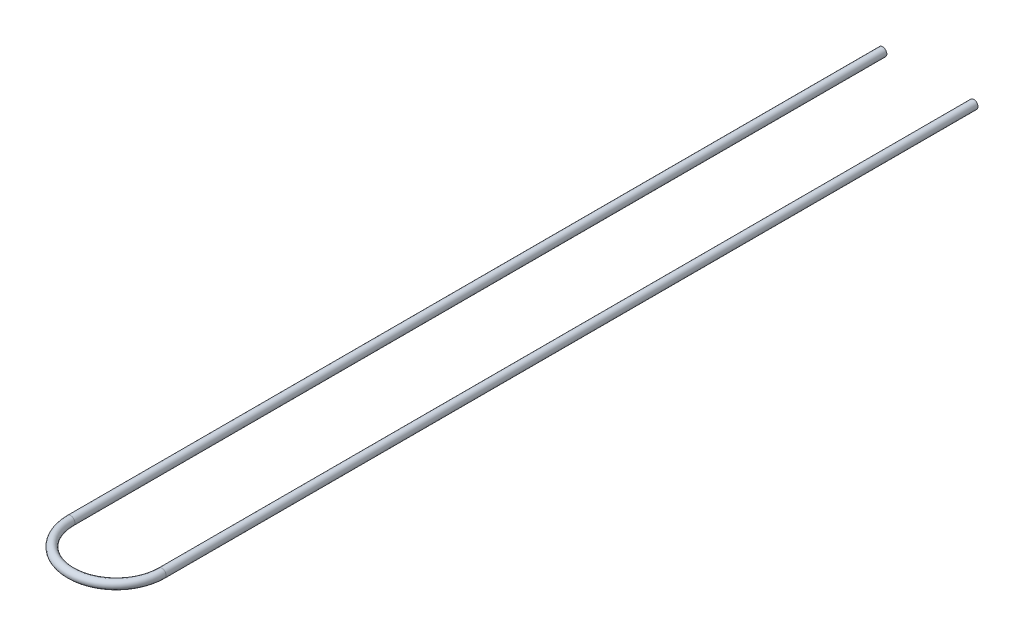
ISO-10303-21;
HEADER;
FILE_DESCRIPTION(('STEP AP214'),'2;1');
FILE_NAME('part.step','',(''),(''),'','','');
FILE_SCHEMA(('AUTOMOTIVE_DESIGN { 1 0 10303 214 1 1 1 1 }'));
ENDSEC;
DATA;
#1=APPLICATION_CONTEXT('core data for automotive mechanical design processes');
#2=APPLICATION_PROTOCOL_DEFINITION('international standard','automotive_design',2000,#1);
#3=PRODUCT_CONTEXT('',#1,'mechanical');
#4=PRODUCT('Part','Part','',(#3));
#5=PRODUCT_RELATED_PRODUCT_CATEGORY('part','',(#4));
#6=PRODUCT_DEFINITION_FORMATION('','',#4);
#7=PRODUCT_DEFINITION_CONTEXT('part definition',#1,'design');
#8=PRODUCT_DEFINITION('design','',#6,#7);
#9=PRODUCT_DEFINITION_SHAPE('','',#8);
#10=(LENGTH_UNIT() NAMED_UNIT(*) SI_UNIT(.MILLI.,.METRE.));
#11=(NAMED_UNIT(*) PLANE_ANGLE_UNIT() SI_UNIT($,.RADIAN.));
#12=(NAMED_UNIT(*) SI_UNIT($,.STERADIAN.) SOLID_ANGLE_UNIT());
#13=UNCERTAINTY_MEASURE_WITH_UNIT(LENGTH_MEASURE(1.E-05),#10,'distance_accuracy_value','');
#14=(GEOMETRIC_REPRESENTATION_CONTEXT(3) GLOBAL_UNCERTAINTY_ASSIGNED_CONTEXT((#13)) GLOBAL_UNIT_ASSIGNED_CONTEXT((#10,
#11,#12)) REPRESENTATION_CONTEXT('',''));
#15=CARTESIAN_POINT('',(0.,0.,0.));
#16=DIRECTION('',(0.,0.,1.));
#17=DIRECTION('',(1.,0.,0.));
#18=AXIS2_PLACEMENT_3D('',#15,#16,#17);
#19=CARTESIAN_POINT('',(-40.,0.,299.999999999999));
#20=DIRECTION('',(0.,0.,1.));
#21=DIRECTION('',(1.,0.,0.));
#22=AXIS2_PLACEMENT_3D('',#19,#20,#21);
#23=CYLINDRICAL_SURFACE('',#22,11.1);
#24=CARTESIAN_POINT('',(-39.9999999999997,0.,2440.));
#25=DIRECTION('',(0.,0.,1.));
#26=DIRECTION('',(1.,0.,0.));
#27=AXIS2_PLACEMENT_3D('',#24,#25,#26);
#28=CIRCLE('',#27,11.1);
#29=CARTESIAN_POINT('',(-51.0999999999997,0.,2440.));
#30=VERTEX_POINT('',#29);
#31=EDGE_CURVE('E54',#30,#30,#28,.T.);
#32=ORIENTED_EDGE('',*,*,#31,.F.);
#33=EDGE_LOOP('',(#32));
#34=FACE_BOUND('',#33,.T.);
#35=CARTESIAN_POINT('',(-40.,0.,299.999999999999));
#36=DIRECTION('',(0.,0.,1.));
#37=DIRECTION('',(1.,0.,0.));
#38=AXIS2_PLACEMENT_3D('',#35,#36,#37);
#39=CIRCLE('',#38,11.1);
#40=CARTESIAN_POINT('',(-28.9,0.,299.999999999999));
#41=VERTEX_POINT('',#40);
#42=EDGE_CURVE('E52',#41,#41,#39,.T.);
#43=ORIENTED_EDGE('',*,*,#42,.T.);
#44=EDGE_LOOP('',(#43));
#45=FACE_BOUND('',#44,.T.);
#46=ADVANCED_FACE('F31',(#34,#45),#23,.T.);
#47=CARTESIAN_POINT('',(80.1550000000003,0.,2440.));
#48=DIRECTION('',(0.,1.,0.));
#49=DIRECTION('',(0.,0.,1.));
#50=AXIS2_PLACEMENT_3D('',#47,#48,#49);
#51=TOROIDAL_SURFACE('',#50,120.155,11.1);
#52=CARTESIAN_POINT('',(200.31,0.,2440.));
#53=DIRECTION('',(0.,0.,-1.));
#54=DIRECTION('',(-1.,0.,0.));
#55=AXIS2_PLACEMENT_3D('',#52,#53,#54);
#56=CIRCLE('',#55,11.1);
#57=CARTESIAN_POINT('',(211.41,0.,2440.));
#58=VERTEX_POINT('',#57);
#59=EDGE_CURVE('E35',#58,#58,#56,.T.);
#60=CARTESIAN_POINT('',(80.1550000000003,0.,2440.));
#61=DIRECTION('',(0.,1.,0.));
#62=DIRECTION('',(0.,0.,1.));
#63=AXIS2_PLACEMENT_3D('',#60,#61,#62);
#64=CIRCLE('',#63,131.255);
#65=EDGE_CURVE('',#30,#58,#64,.T.);
#66=ORIENTED_EDGE('',*,*,#31,.T.);
#67=ORIENTED_EDGE('',*,*,#59,.F.);
#68=ORIENTED_EDGE('',*,*,#65,.T.);
#69=ORIENTED_EDGE('',*,*,#65,.F.);
#70=EDGE_LOOP('',(#66,#68,#67,#69));
#71=FACE_BOUND('',#70,.T.);
#72=ADVANCED_FACE('F62',(#71),#51,.T.);
#73=CARTESIAN_POINT('',(200.31,0.,2440.));
#74=DIRECTION('',(0.,0.,-1.));
#75=DIRECTION('',(-1.,0.,0.));
#76=AXIS2_PLACEMENT_3D('',#73,#74,#75);
#77=CYLINDRICAL_SURFACE('',#76,11.1);
#78=CARTESIAN_POINT('',(200.31,0.,299.999999999999));
#79=DIRECTION('',(0.,0.,-1.));
#80=DIRECTION('',(-1.,0.,0.));
#81=AXIS2_PLACEMENT_3D('',#78,#79,#80);
#82=CIRCLE('',#81,11.1);
#83=CARTESIAN_POINT('',(189.21,0.,299.999999999999));
#84=VERTEX_POINT('',#83);
#85=EDGE_CURVE('E48',#84,#84,#82,.T.);
#86=ORIENTED_EDGE('',*,*,#85,.F.);
#87=EDGE_LOOP('',(#86));
#88=FACE_BOUND('',#87,.T.);
#89=ORIENTED_EDGE('',*,*,#59,.T.);
#90=EDGE_LOOP('',(#89));
#91=FACE_BOUND('',#90,.T.);
#92=ADVANCED_FACE('F33',(#88,#91),#77,.T.);
#93=CARTESIAN_POINT('',(-40.,0.,299.999999999999));
#94=DIRECTION('',(0.,0.,1.));
#95=DIRECTION('',(1.,0.,0.));
#96=AXIS2_PLACEMENT_3D('',#93,#94,#95);
#97=PLANE('',#96);
#98=CARTESIAN_POINT('',(-40.,0.,299.999999999999));
#99=DIRECTION('',(0.,0.,1.));
#100=DIRECTION('',(1.,0.,0.));
#101=AXIS2_PLACEMENT_3D('',#98,#99,#100);
#102=CIRCLE('',#101,9.95000000000001);
#103=CARTESIAN_POINT('',(-30.05,0.,299.999999999999));
#104=VERTEX_POINT('',#103);
#105=EDGE_CURVE('E51',#104,#104,#102,.F.);
#106=ORIENTED_EDGE('',*,*,#105,.F.);
#107=EDGE_LOOP('',(#106));
#108=FACE_BOUND('',#107,.T.);
#109=ORIENTED_EDGE('',*,*,#42,.F.);
#110=EDGE_LOOP('',(#109));
#111=FACE_BOUND('',#110,.T.);
#112=ADVANCED_FACE('F68',(#108,#111),#97,.F.);
#113=CARTESIAN_POINT('',(200.31,0.,299.999999999999));
#114=DIRECTION('',(0.,0.,-1.));
#115=DIRECTION('',(-1.,0.,0.));
#116=AXIS2_PLACEMENT_3D('',#113,#114,#115);
#117=PLANE('',#116);
#118=CARTESIAN_POINT('',(200.31,0.,299.999999999999));
#119=DIRECTION('',(0.,0.,-1.));
#120=DIRECTION('',(-1.,0.,0.));
#121=AXIS2_PLACEMENT_3D('',#118,#119,#120);
#122=CIRCLE('',#121,9.95000000000001);
#123=CARTESIAN_POINT('',(190.36,0.,299.999999999999));
#124=VERTEX_POINT('',#123);
#125=EDGE_CURVE('E10',#124,#124,#122,.F.);
#126=ORIENTED_EDGE('',*,*,#125,.T.);
#127=EDGE_LOOP('',(#126));
#128=FACE_BOUND('',#127,.T.);
#129=ORIENTED_EDGE('',*,*,#85,.T.);
#130=EDGE_LOOP('',(#129));
#131=FACE_BOUND('',#130,.T.);
#132=ADVANCED_FACE('F86',(#128,#131),#117,.T.);
#133=CARTESIAN_POINT('',(-40.,0.,299.999999999999));
#134=DIRECTION('',(0.,0.,1.));
#135=DIRECTION('',(1.,0.,0.));
#136=AXIS2_PLACEMENT_3D('',#133,#134,#135);
#137=CYLINDRICAL_SURFACE('',#136,9.95000000000001);
#138=CARTESIAN_POINT('',(-39.9999999999997,0.,2440.));
#139=DIRECTION('',(0.,0.,1.));
#140=DIRECTION('',(1.,0.,0.));
#141=AXIS2_PLACEMENT_3D('',#138,#139,#140);
#142=CIRCLE('',#141,9.95000000000001);
#143=CARTESIAN_POINT('',(-49.9499999999997,0.,2440.));
#144=VERTEX_POINT('',#143);
#145=EDGE_CURVE('E44',#144,#144,#142,.F.);
#146=ORIENTED_EDGE('',*,*,#145,.F.);
#147=EDGE_LOOP('',(#146));
#148=FACE_BOUND('',#147,.T.);
#149=ORIENTED_EDGE('',*,*,#105,.T.);
#150=EDGE_LOOP('',(#149));
#151=FACE_BOUND('',#150,.T.);
#152=ADVANCED_FACE('F80',(#148,#151),#137,.F.);
#153=CARTESIAN_POINT('',(80.1550000000003,0.,2440.));
#154=DIRECTION('',(0.,1.,0.));
#155=DIRECTION('',(0.,0.,1.));
#156=AXIS2_PLACEMENT_3D('',#153,#154,#155);
#157=TOROIDAL_SURFACE('',#156,120.155,9.95000000000001);
#158=CARTESIAN_POINT('',(200.31,0.,2440.));
#159=DIRECTION('',(0.,0.,-1.));
#160=DIRECTION('',(-1.,0.,0.));
#161=AXIS2_PLACEMENT_3D('',#158,#159,#160);
#162=CIRCLE('',#161,9.95000000000001);
#163=CARTESIAN_POINT('',(210.26,0.,2440.));
#164=VERTEX_POINT('',#163);
#165=EDGE_CURVE('E39',#164,#164,#162,.F.);
#166=CARTESIAN_POINT('',(80.1550000000003,0.,2440.));
#167=DIRECTION('',(0.,1.,0.));
#168=DIRECTION('',(0.,0.,1.));
#169=AXIS2_PLACEMENT_3D('',#166,#167,#168);
#170=CIRCLE('',#169,130.105);
#171=EDGE_CURVE('',#144,#164,#170,.T.);
#172=ORIENTED_EDGE('',*,*,#145,.T.);
#173=ORIENTED_EDGE('',*,*,#165,.F.);
#174=ORIENTED_EDGE('',*,*,#171,.T.);
#175=ORIENTED_EDGE('',*,*,#171,.F.);
#176=EDGE_LOOP('',(#172,#174,#173,#175));
#177=FACE_BOUND('',#176,.T.);
#178=ADVANCED_FACE('F74',(#177),#157,.F.);
#179=CARTESIAN_POINT('',(200.31,0.,2440.));
#180=DIRECTION('',(0.,0.,-1.));
#181=DIRECTION('',(-1.,0.,0.));
#182=AXIS2_PLACEMENT_3D('',#179,#180,#181);
#183=CYLINDRICAL_SURFACE('',#182,9.95000000000001);
#184=ORIENTED_EDGE('',*,*,#125,.F.);
#185=EDGE_LOOP('',(#184));
#186=FACE_BOUND('',#185,.T.);
#187=ORIENTED_EDGE('',*,*,#165,.T.);
#188=EDGE_LOOP('',(#187));
#189=FACE_BOUND('',#188,.T.);
#190=ADVANCED_FACE('F72',(#186,#189),#183,.F.);
#191=CLOSED_SHELL('',(#46,#72,#92,#112,#132,#152,#178,#190));
#192=MANIFOLD_SOLID_BREP('B2',#191);
#193=ADVANCED_BREP_SHAPE_REPRESENTATION('',(#18,#192),#14);
#194=SHAPE_DEFINITION_REPRESENTATION(#9,#193);
ENDSEC;
END-ISO-10303-21;
